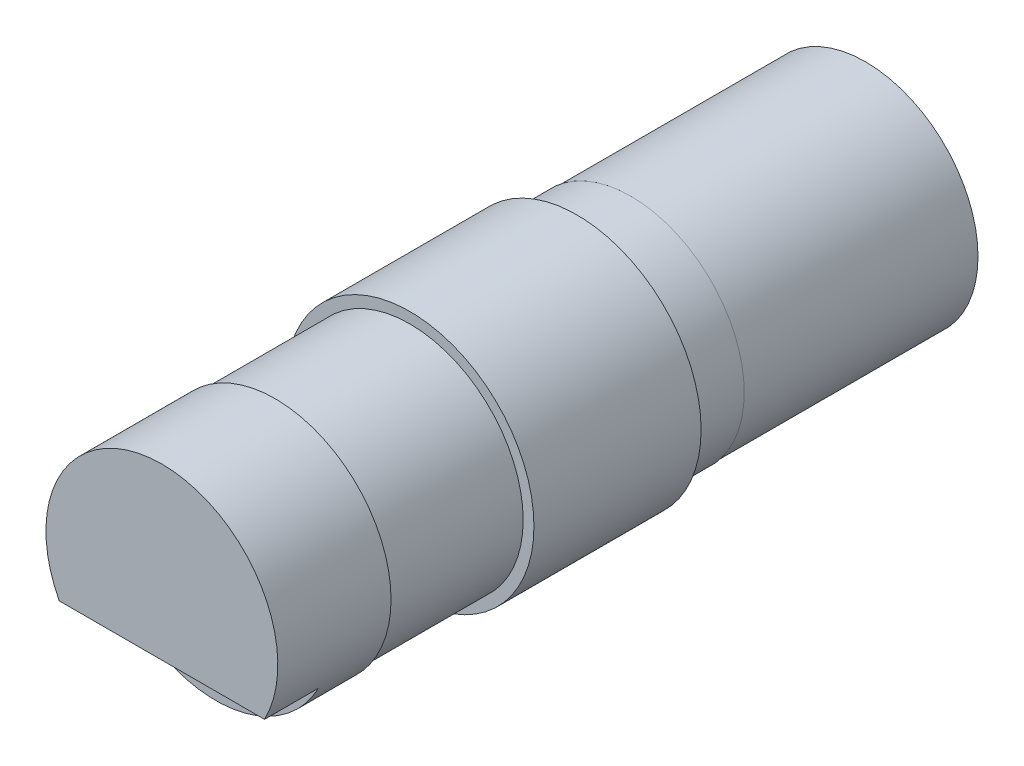
ISO-10303-21;
HEADER;
FILE_DESCRIPTION(('STEP AP214'),'2;1');
FILE_NAME('part.step','',(''),(''),'','','');
FILE_SCHEMA(('AUTOMOTIVE_DESIGN { 1 0 10303 214 1 1 1 1 }'));
ENDSEC;
DATA;
#1=APPLICATION_CONTEXT('core data for automotive mechanical design processes');
#2=APPLICATION_PROTOCOL_DEFINITION('international standard','automotive_design',2000,#1);
#3=PRODUCT_CONTEXT('',#1,'mechanical');
#4=PRODUCT('Part','Part','',(#3));
#5=PRODUCT_RELATED_PRODUCT_CATEGORY('part','',(#4));
#6=PRODUCT_DEFINITION_FORMATION('','',#4);
#7=PRODUCT_DEFINITION_CONTEXT('part definition',#1,'design');
#8=PRODUCT_DEFINITION('design','',#6,#7);
#9=PRODUCT_DEFINITION_SHAPE('','',#8);
#10=(LENGTH_UNIT() NAMED_UNIT(*) SI_UNIT(.MILLI.,.METRE.));
#11=(NAMED_UNIT(*) PLANE_ANGLE_UNIT() SI_UNIT($,.RADIAN.));
#12=(NAMED_UNIT(*) SI_UNIT($,.STERADIAN.) SOLID_ANGLE_UNIT());
#13=UNCERTAINTY_MEASURE_WITH_UNIT(LENGTH_MEASURE(1.E-05),#10,'distance_accuracy_value','');
#14=(GEOMETRIC_REPRESENTATION_CONTEXT(3) GLOBAL_UNCERTAINTY_ASSIGNED_CONTEXT((#13)) GLOBAL_UNIT_ASSIGNED_CONTEXT((#10,
#11,#12)) REPRESENTATION_CONTEXT('',''));
#15=CARTESIAN_POINT('',(0.,0.,0.));
#16=DIRECTION('',(0.,0.,1.));
#17=DIRECTION('',(1.,0.,0.));
#18=AXIS2_PLACEMENT_3D('',#15,#16,#17);
#19=CARTESIAN_POINT('',(0.,0.,-25.));
#20=DIRECTION('',(0.,0.,1.));
#21=DIRECTION('',(1.,0.,0.));
#22=AXIS2_PLACEMENT_3D('',#19,#20,#21);
#23=CYLINDRICAL_SURFACE('',#22,21.);
#24=CARTESIAN_POINT('',(0.,0.,-25.));
#25=DIRECTION('',(0.,0.,1.));
#26=DIRECTION('',(1.,0.,0.));
#27=AXIS2_PLACEMENT_3D('',#24,#25,#26);
#28=CIRCLE('',#27,21.);
#29=CARTESIAN_POINT('',(21.,0.,-25.));
#30=VERTEX_POINT('',#29);
#31=EDGE_CURVE('E110',#30,#30,#28,.T.);
#32=ORIENTED_EDGE('',*,*,#31,.T.);
#33=EDGE_LOOP('',(#32));
#34=FACE_BOUND('',#33,.T.);
#35=CARTESIAN_POINT('',(0.,0.,0.));
#36=DIRECTION('',(0.,0.,1.));
#37=DIRECTION('',(1.,0.,0.));
#38=AXIS2_PLACEMENT_3D('',#35,#36,#37);
#39=CIRCLE('',#38,21.);
#40=CARTESIAN_POINT('',(21.,0.,0.));
#41=VERTEX_POINT('',#40);
#42=EDGE_CURVE('E41',#41,#41,#39,.T.);
#43=ORIENTED_EDGE('',*,*,#42,.F.);
#44=EDGE_LOOP('',(#43));
#45=FACE_BOUND('',#44,.T.);
#46=ADVANCED_FACE('F38',(#34,#45),#23,.T.);
#47=CARTESIAN_POINT('',(0.,0.,-56.));
#48=DIRECTION('',(0.,0.,1.));
#49=DIRECTION('',(1.,0.,0.));
#50=AXIS2_PLACEMENT_3D('',#47,#48,#49);
#51=CYLINDRICAL_SURFACE('',#50,23.);
#52=CARTESIAN_POINT('',(0.,0.,-56.));
#53=DIRECTION('',(0.,0.,-1.));
#54=DIRECTION('',(-1.,0.,0.));
#55=AXIS2_PLACEMENT_3D('',#52,#53,#54);
#56=CIRCLE('',#55,23.);
#57=CARTESIAN_POINT('',(-23.,0.,-56.));
#58=VERTEX_POINT('',#57);
#59=EDGE_CURVE('E107',#58,#58,#56,.T.);
#60=ORIENTED_EDGE('',*,*,#59,.F.);
#61=EDGE_LOOP('',(#60));
#62=FACE_BOUND('',#61,.T.);
#63=CARTESIAN_POINT('',(0.,0.,-25.));
#64=DIRECTION('',(0.,0.,-1.));
#65=DIRECTION('',(-1.,0.,0.));
#66=AXIS2_PLACEMENT_3D('',#63,#64,#65);
#67=CIRCLE('',#66,23.);
#68=CARTESIAN_POINT('',(-23.,0.,-25.));
#69=VERTEX_POINT('',#68);
#70=EDGE_CURVE('E104',#69,#69,#67,.T.);
#71=ORIENTED_EDGE('',*,*,#70,.T.);
#72=EDGE_LOOP('',(#71));
#73=FACE_BOUND('',#72,.T.);
#74=ADVANCED_FACE('F122',(#62,#73),#51,.T.);
#75=CARTESIAN_POINT('',(0.,0.,-56.));
#76=DIRECTION('',(0.,0.,-1.));
#77=DIRECTION('',(-1.,0.,0.));
#78=AXIS2_PLACEMENT_3D('',#75,#76,#77);
#79=PLANE('',#78);
#80=CARTESIAN_POINT('',(0.,0.,-56.));
#81=DIRECTION('',(0.,0.,-1.));
#82=DIRECTION('',(-1.,0.,0.));
#83=AXIS2_PLACEMENT_3D('',#80,#81,#82);
#84=CIRCLE('',#83,21.);
#85=CARTESIAN_POINT('',(-21.,0.,-56.));
#86=VERTEX_POINT('',#85);
#87=EDGE_CURVE('E101',#86,#86,#84,.T.);
#88=ORIENTED_EDGE('',*,*,#87,.F.);
#89=EDGE_LOOP('',(#88));
#90=FACE_BOUND('',#89,.T.);
#91=ORIENTED_EDGE('',*,*,#59,.T.);
#92=EDGE_LOOP('',(#91));
#93=FACE_BOUND('',#92,.T.);
#94=ADVANCED_FACE('F126',(#90,#93),#79,.T.);
#95=CARTESIAN_POINT('',(0.,0.,-25.));
#96=DIRECTION('',(0.,0.,-1.));
#97=DIRECTION('',(-1.,0.,0.));
#98=AXIS2_PLACEMENT_3D('',#95,#96,#97);
#99=PLANE('',#98);
#100=ORIENTED_EDGE('',*,*,#31,.F.);
#101=EDGE_LOOP('',(#100));
#102=FACE_BOUND('',#101,.T.);
#103=ORIENTED_EDGE('',*,*,#70,.F.);
#104=EDGE_LOOP('',(#103));
#105=FACE_BOUND('',#104,.T.);
#106=ADVANCED_FACE('F131',(#102,#105),#99,.F.);
#107=CARTESIAN_POINT('',(0.,0.,-66.));
#108=DIRECTION('',(0.,0.,1.));
#109=DIRECTION('',(1.,0.,0.));
#110=AXIS2_PLACEMENT_3D('',#107,#108,#109);
#111=CYLINDRICAL_SURFACE('',#110,21.);
#112=CARTESIAN_POINT('',(0.,0.,-66.));
#113=DIRECTION('',(0.,0.,-1.));
#114=DIRECTION('',(-1.,0.,0.));
#115=AXIS2_PLACEMENT_3D('',#112,#113,#114);
#116=CIRCLE('',#115,21.);
#117=CARTESIAN_POINT('',(-21.,0.,-66.));
#118=VERTEX_POINT('',#117);
#119=EDGE_CURVE('E98',#118,#118,#116,.T.);
#120=ORIENTED_EDGE('',*,*,#119,.F.);
#121=EDGE_LOOP('',(#120));
#122=FACE_BOUND('',#121,.T.);
#123=ORIENTED_EDGE('',*,*,#87,.T.);
#124=EDGE_LOOP('',(#123));
#125=FACE_BOUND('',#124,.T.);
#126=ADVANCED_FACE('F138',(#122,#125),#111,.T.);
#127=CARTESIAN_POINT('',(0.,0.,-66.));
#128=DIRECTION('',(0.,0.,-1.));
#129=DIRECTION('',(-1.,0.,0.));
#130=AXIS2_PLACEMENT_3D('',#127,#128,#129);
#131=PLANE('',#130);
#132=CARTESIAN_POINT('',(0.,0.,-66.));
#133=DIRECTION('',(0.,0.,-1.));
#134=DIRECTION('',(-1.,0.,0.));
#135=AXIS2_PLACEMENT_3D('',#132,#133,#134);
#136=CIRCLE('',#135,20.85);
#137=CARTESIAN_POINT('',(-20.85,0.,-66.));
#138=VERTEX_POINT('',#137);
#139=EDGE_CURVE('E46',#138,#138,#136,.T.);
#140=ORIENTED_EDGE('',*,*,#139,.F.);
#141=EDGE_LOOP('',(#140));
#142=FACE_BOUND('',#141,.T.);
#143=ORIENTED_EDGE('',*,*,#119,.T.);
#144=EDGE_LOOP('',(#143));
#145=FACE_BOUND('',#144,.T.);
#146=ADVANCED_FACE('F143',(#142,#145),#131,.T.);
#147=CARTESIAN_POINT('',(0.,0.,-109.5));
#148=DIRECTION('',(0.,0.,1.));
#149=DIRECTION('',(1.,0.,0.));
#150=AXIS2_PLACEMENT_3D('',#147,#148,#149);
#151=CYLINDRICAL_SURFACE('',#150,20.85);
#152=CARTESIAN_POINT('',(0.,0.,-109.5));
#153=DIRECTION('',(0.,0.,-1.));
#154=DIRECTION('',(-1.,0.,0.));
#155=AXIS2_PLACEMENT_3D('',#152,#153,#154);
#156=CIRCLE('',#155,20.85);
#157=CARTESIAN_POINT('',(-20.85,0.,-109.5));
#158=VERTEX_POINT('',#157);
#159=EDGE_CURVE('E94',#158,#158,#156,.T.);
#160=ORIENTED_EDGE('',*,*,#159,.F.);
#161=EDGE_LOOP('',(#160));
#162=FACE_BOUND('',#161,.T.);
#163=ORIENTED_EDGE('',*,*,#139,.T.);
#164=EDGE_LOOP('',(#163));
#165=FACE_BOUND('',#164,.T.);
#166=ADVANCED_FACE('F147',(#162,#165),#151,.T.);
#167=CARTESIAN_POINT('',(0.,0.,-109.5));
#168=DIRECTION('',(0.,0.,-1.));
#169=DIRECTION('',(-1.,0.,0.));
#170=AXIS2_PLACEMENT_3D('',#167,#168,#169);
#171=PLANE('',#170);
#172=CARTESIAN_POINT('',(0.,17.5,-109.5));
#173=DIRECTION('',(0.,0.,-1.));
#174=DIRECTION('',(-1.,0.,0.));
#175=AXIS2_PLACEMENT_3D('',#172,#173,#174);
#176=CIRCLE('',#175,2.);
#177=CARTESIAN_POINT('',(-2.,17.5,-109.5));
#178=VERTEX_POINT('',#177);
#179=EDGE_CURVE('E219',#178,#178,#176,.T.);
#180=ORIENTED_EDGE('',*,*,#179,.F.);
#181=EDGE_LOOP('',(#180));
#182=FACE_BOUND('',#181,.T.);
#183=CARTESIAN_POINT('',(-17.5000000000005,4.94165217184309E-13,-109.5));
#184=DIRECTION('',(0.,0.,-1.));
#185=DIRECTION('',(-1.,0.,0.));
#186=AXIS2_PLACEMENT_3D('',#183,#184,#185);
#187=CIRCLE('',#186,2.00000000000039);
#188=CARTESIAN_POINT('',(-19.5000000000009,4.94165217184309E-13,-109.5));
#189=VERTEX_POINT('',#188);
#190=EDGE_CURVE('E227',#189,#189,#187,.T.);
#191=ORIENTED_EDGE('',*,*,#190,.F.);
#192=EDGE_LOOP('',(#191));
#193=FACE_BOUND('',#192,.T.);
#194=CARTESIAN_POINT('',(-9.88330434368617E-13,-17.5,-109.5));
#195=DIRECTION('',(0.,0.,-1.));
#196=DIRECTION('',(-1.,0.,0.));
#197=AXIS2_PLACEMENT_3D('',#194,#195,#196);
#198=CIRCLE('',#197,2.00000000000106);
#199=CARTESIAN_POINT('',(-2.00000000000205,-17.5,-109.5));
#200=VERTEX_POINT('',#199);
#201=EDGE_CURVE('E233',#200,#200,#198,.T.);
#202=ORIENTED_EDGE('',*,*,#201,.F.);
#203=EDGE_LOOP('',(#202));
#204=FACE_BOUND('',#203,.T.);
#205=CARTESIAN_POINT('',(17.4999999999995,-4.96308349082816E-13,-109.5));
#206=DIRECTION('',(0.,0.,-1.));
#207=DIRECTION('',(-1.,0.,0.));
#208=AXIS2_PLACEMENT_3D('',#205,#206,#207);
#209=CIRCLE('',#208,2.0000000000008);
#210=CARTESIAN_POINT('',(15.4999999999987,-4.96308349082816E-13,-109.5));
#211=VERTEX_POINT('',#210);
#212=EDGE_CURVE('E239',#211,#211,#209,.T.);
#213=ORIENTED_EDGE('',*,*,#212,.F.);
#214=EDGE_LOOP('',(#213));
#215=FACE_BOUND('',#214,.T.);
#216=CARTESIAN_POINT('',(0.,0.,-109.5));
#217=DIRECTION('',(0.,0.,-1.));
#218=DIRECTION('',(-1.,0.,0.));
#219=AXIS2_PLACEMENT_3D('',#216,#217,#218);
#220=CIRCLE('',#219,13.);
#221=CARTESIAN_POINT('',(-13.,0.,-109.5));
#222=VERTEX_POINT('',#221);
#223=EDGE_CURVE('E11',#222,#222,#220,.T.);
#224=ORIENTED_EDGE('',*,*,#223,.F.);
#225=EDGE_LOOP('',(#224));
#226=FACE_BOUND('',#225,.T.);
#227=ORIENTED_EDGE('',*,*,#159,.T.);
#228=EDGE_LOOP('',(#227));
#229=FACE_BOUND('',#228,.T.);
#230=ADVANCED_FACE('F151',(#182,#193,#204,#215,#226,#229),#171,.T.);
#231=CARTESIAN_POINT('',(0.,0.,-111.5));
#232=DIRECTION('',(0.,0.,1.));
#233=DIRECTION('',(1.,0.,0.));
#234=AXIS2_PLACEMENT_3D('',#231,#232,#233);
#235=CYLINDRICAL_SURFACE('',#234,13.);
#236=CARTESIAN_POINT('',(0.,0.,-111.5));
#237=DIRECTION('',(0.,0.,-1.));
#238=DIRECTION('',(-1.,0.,0.));
#239=AXIS2_PLACEMENT_3D('',#236,#237,#238);
#240=CIRCLE('',#239,13.);
#241=CARTESIAN_POINT('',(-13.,0.,-111.5));
#242=VERTEX_POINT('',#241);
#243=EDGE_CURVE('E91',#242,#242,#240,.T.);
#244=ORIENTED_EDGE('',*,*,#243,.F.);
#245=EDGE_LOOP('',(#244));
#246=FACE_BOUND('',#245,.T.);
#247=ORIENTED_EDGE('',*,*,#223,.T.);
#248=EDGE_LOOP('',(#247));
#249=FACE_BOUND('',#248,.T.);
#250=ADVANCED_FACE('F155',(#246,#249),#235,.T.);
#251=CARTESIAN_POINT('',(0.,0.,-111.5));
#252=DIRECTION('',(0.,0.,-1.));
#253=DIRECTION('',(-1.,0.,0.));
#254=AXIS2_PLACEMENT_3D('',#251,#252,#253);
#255=PLANE('',#254);
#256=CARTESIAN_POINT('',(0.,0.,-111.5));
#257=DIRECTION('',(0.,0.,-1.));
#258=DIRECTION('',(-1.,0.,0.));
#259=AXIS2_PLACEMENT_3D('',#256,#257,#258);
#260=CIRCLE('',#259,4.);
#261=CARTESIAN_POINT('',(-4.,0.,-111.5));
#262=VERTEX_POINT('',#261);
#263=EDGE_CURVE('E81',#262,#262,#260,.T.);
#264=ORIENTED_EDGE('',*,*,#263,.F.);
#265=EDGE_LOOP('',(#264));
#266=FACE_BOUND('',#265,.T.);
#267=ORIENTED_EDGE('',*,*,#243,.T.);
#268=EDGE_LOOP('',(#267));
#269=FACE_BOUND('',#268,.T.);
#270=ADVANCED_FACE('F159',(#266,#269),#255,.T.);
#271=CARTESIAN_POINT('',(0.,0.,-108.5));
#272=DIRECTION('',(0.,0.,-1.));
#273=DIRECTION('',(-1.,0.,0.));
#274=AXIS2_PLACEMENT_3D('',#271,#272,#273);
#275=CYLINDRICAL_SURFACE('',#274,4.);
#276=CARTESIAN_POINT('',(0.,0.,-108.5));
#277=DIRECTION('',(0.,0.,-1.));
#278=DIRECTION('',(-1.,0.,0.));
#279=AXIS2_PLACEMENT_3D('',#276,#277,#278);
#280=CIRCLE('',#279,4.);
#281=CARTESIAN_POINT('',(-4.,0.,-108.5));
#282=VERTEX_POINT('',#281);
#283=EDGE_CURVE('E84',#282,#282,#280,.T.);
#284=ORIENTED_EDGE('',*,*,#283,.F.);
#285=EDGE_LOOP('',(#284));
#286=FACE_BOUND('',#285,.T.);
#287=ORIENTED_EDGE('',*,*,#263,.T.);
#288=EDGE_LOOP('',(#287));
#289=FACE_BOUND('',#288,.T.);
#290=ADVANCED_FACE('F163',(#286,#289),#275,.F.);
#291=CARTESIAN_POINT('',(0.,0.,-108.5));
#292=DIRECTION('',(0.,0.,-1.));
#293=DIRECTION('',(-1.,0.,0.));
#294=AXIS2_PLACEMENT_3D('',#291,#292,#293);
#295=PLANE('',#294);
#296=ORIENTED_EDGE('',*,*,#283,.T.);
#297=EDGE_LOOP('',(#296));
#298=FACE_BOUND('',#297,.T.);
#299=ADVANCED_FACE('F167',(#298),#295,.T.);
#300=CARTESIAN_POINT('',(0.,0.,21.));
#301=DIRECTION('',(0.,0.,-1.));
#302=DIRECTION('',(-1.,0.,0.));
#303=AXIS2_PLACEMENT_3D('',#300,#301,#302);
#304=CYLINDRICAL_SURFACE('',#303,21.5);
#305=CARTESIAN_POINT('',(0.,0.,21.));
#306=DIRECTION('',(0.,0.,1.));
#307=DIRECTION('',(1.,0.,0.));
#308=AXIS2_PLACEMENT_3D('',#305,#306,#307);
#309=CIRCLE('',#308,21.5);
#310=CARTESIAN_POINT('',(19.0328663106743,-10.,21.));
#311=VERTEX_POINT('',#310);
#312=CARTESIAN_POINT('',(-19.0328663106743,-10.,21.));
#313=VERTEX_POINT('',#312);
#314=EDGE_CURVE('E77',#311,#313,#309,.T.);
#315=ORIENTED_EDGE('',*,*,#314,.F.);
#316=DIRECTION('',(0.,0.,1.));
#317=VECTOR('',#316,1.);
#318=CARTESIAN_POINT('',(19.0328663106743,-10.,11.));
#319=LINE('',#318,#317);
#320=CARTESIAN_POINT('',(19.0328663106743,-10.,11.));
#321=VERTEX_POINT('',#320);
#322=EDGE_CURVE('E54',#321,#311,#319,.T.);
#323=ORIENTED_EDGE('',*,*,#322,.F.);
#324=CARTESIAN_POINT('',(0.,0.,11.));
#325=DIRECTION('',(0.,0.,1.));
#326=DIRECTION('',(1.,0.,0.));
#327=AXIS2_PLACEMENT_3D('',#324,#325,#326);
#328=CIRCLE('',#327,21.5);
#329=CARTESIAN_POINT('',(-19.0328663106743,-10.,11.));
#330=VERTEX_POINT('',#329);
#331=EDGE_CURVE('E70',#330,#321,#328,.T.);
#332=ORIENTED_EDGE('',*,*,#331,.F.);
#333=DIRECTION('',(0.,0.,1.));
#334=VECTOR('',#333,1.);
#335=CARTESIAN_POINT('',(-19.0328663106743,-10.,11.));
#336=LINE('',#335,#334);
#337=EDGE_CURVE('E60',#330,#313,#336,.T.);
#338=ORIENTED_EDGE('',*,*,#337,.T.);
#339=EDGE_LOOP('',(#315,#323,#332,#338));
#340=FACE_BOUND('',#339,.T.);
#341=CARTESIAN_POINT('',(0.,0.,0.));
#342=DIRECTION('',(0.,0.,1.));
#343=DIRECTION('',(1.,0.,0.));
#344=AXIS2_PLACEMENT_3D('',#341,#342,#343);
#345=CIRCLE('',#344,21.5);
#346=CARTESIAN_POINT('',(21.5,0.,0.));
#347=VERTEX_POINT('',#346);
#348=EDGE_CURVE('E78',#347,#347,#345,.T.);
#349=ORIENTED_EDGE('',*,*,#348,.T.);
#350=EDGE_LOOP('',(#349));
#351=FACE_BOUND('',#350,.T.);
#352=ADVANCED_FACE('F75',(#340,#351),#304,.T.);
#353=CARTESIAN_POINT('',(0.,0.,21.));
#354=DIRECTION('',(0.,0.,1.));
#355=DIRECTION('',(1.,0.,0.));
#356=AXIS2_PLACEMENT_3D('',#353,#354,#355);
#357=PLANE('',#356);
#358=DIRECTION('',(-1.,0.,0.));
#359=VECTOR('',#358,1.);
#360=CARTESIAN_POINT('',(-19.0328663106743,-10.,21.));
#361=LINE('',#360,#359);
#362=EDGE_CURVE('E65',#311,#313,#361,.T.);
#363=ORIENTED_EDGE('',*,*,#362,.F.);
#364=ORIENTED_EDGE('',*,*,#314,.T.);
#365=EDGE_LOOP('',(#363,#364));
#366=FACE_BOUND('',#365,.T.);
#367=ADVANCED_FACE('F80',(#366),#357,.T.);
#368=CARTESIAN_POINT('',(0.,0.,0.));
#369=DIRECTION('',(0.,0.,1.));
#370=DIRECTION('',(1.,0.,0.));
#371=AXIS2_PLACEMENT_3D('',#368,#369,#370);
#372=PLANE('',#371);
#373=ORIENTED_EDGE('',*,*,#42,.T.);
#374=EDGE_LOOP('',(#373));
#375=FACE_BOUND('',#374,.T.);
#376=ORIENTED_EDGE('',*,*,#348,.F.);
#377=EDGE_LOOP('',(#376));
#378=FACE_BOUND('',#377,.T.);
#379=ADVANCED_FACE('F118',(#375,#378),#372,.F.);
#380=CARTESIAN_POINT('',(-19.0328663106743,-10.,11.));
#381=DIRECTION('',(0.,1.,0.));
#382=DIRECTION('',(0.,0.,1.));
#383=AXIS2_PLACEMENT_3D('',#380,#381,#382);
#384=PLANE('',#383);
#385=ORIENTED_EDGE('',*,*,#362,.T.);
#386=ORIENTED_EDGE('',*,*,#337,.F.);
#387=DIRECTION('',(-1.,0.,0.));
#388=VECTOR('',#387,1.);
#389=CARTESIAN_POINT('',(-19.0328663106743,-10.,11.));
#390=LINE('',#389,#388);
#391=EDGE_CURVE('E243',#321,#330,#390,.T.);
#392=ORIENTED_EDGE('',*,*,#391,.F.);
#393=ORIENTED_EDGE('',*,*,#322,.T.);
#394=EDGE_LOOP('',(#385,#386,#392,#393));
#395=FACE_BOUND('',#394,.T.);
#396=ADVANCED_FACE('F66',(#395),#384,.F.);
#397=CARTESIAN_POINT('',(0.,0.,11.));
#398=DIRECTION('',(0.,0.,1.));
#399=DIRECTION('',(1.,0.,0.));
#400=AXIS2_PLACEMENT_3D('',#397,#398,#399);
#401=PLANE('',#400);
#402=ORIENTED_EDGE('',*,*,#331,.T.);
#403=ORIENTED_EDGE('',*,*,#391,.T.);
#404=EDGE_LOOP('',(#402,#403));
#405=FACE_BOUND('',#404,.T.);
#406=ADVANCED_FACE('F180',(#405),#401,.T.);
#407=CARTESIAN_POINT('',(17.4999999999995,-4.96308349082816E-13,-102.5));
#408=DIRECTION('',(0.,0.,-1.));
#409=DIRECTION('',(-1.,0.,0.));
#410=AXIS2_PLACEMENT_3D('',#407,#408,#409);
#411=CYLINDRICAL_SURFACE('',#410,2.0000000000008);
#412=CARTESIAN_POINT('',(17.4999999999995,-4.96308349082816E-13,-102.5));
#413=DIRECTION('',(0.,0.,-1.));
#414=DIRECTION('',(-1.,0.,0.));
#415=AXIS2_PLACEMENT_3D('',#412,#413,#414);
#416=CIRCLE('',#415,2.0000000000008);
#417=CARTESIAN_POINT('',(15.4999999999987,-4.96308349082816E-13,-102.5));
#418=VERTEX_POINT('',#417);
#419=EDGE_CURVE('E236',#418,#418,#416,.T.);
#420=ORIENTED_EDGE('',*,*,#419,.F.);
#421=EDGE_LOOP('',(#420));
#422=FACE_BOUND('',#421,.T.);
#423=ORIENTED_EDGE('',*,*,#212,.T.);
#424=EDGE_LOOP('',(#423));
#425=FACE_BOUND('',#424,.T.);
#426=ADVANCED_FACE('F183',(#422,#425),#411,.F.);
#427=CARTESIAN_POINT('',(17.4999999999995,-4.96308349082816E-13,-102.5));
#428=DIRECTION('',(0.,0.,-1.));
#429=DIRECTION('',(-1.,0.,0.));
#430=AXIS2_PLACEMENT_3D('',#427,#428,#429);
#431=PLANE('',#430);
#432=ORIENTED_EDGE('',*,*,#419,.T.);
#433=EDGE_LOOP('',(#432));
#434=FACE_BOUND('',#433,.T.);
#435=ADVANCED_FACE('F187',(#434),#431,.T.);
#436=CARTESIAN_POINT('',(-9.88330434368617E-13,-17.5,-102.5));
#437=DIRECTION('',(0.,0.,-1.));
#438=DIRECTION('',(-1.,0.,0.));
#439=AXIS2_PLACEMENT_3D('',#436,#437,#438);
#440=CYLINDRICAL_SURFACE('',#439,2.00000000000106);
#441=CARTESIAN_POINT('',(-9.88330434368617E-13,-17.5,-102.5));
#442=DIRECTION('',(0.,0.,-1.));
#443=DIRECTION('',(-1.,0.,0.));
#444=AXIS2_PLACEMENT_3D('',#441,#442,#443);
#445=CIRCLE('',#444,2.00000000000106);
#446=CARTESIAN_POINT('',(-2.00000000000205,-17.5,-102.5));
#447=VERTEX_POINT('',#446);
#448=EDGE_CURVE('E230',#447,#447,#445,.T.);
#449=ORIENTED_EDGE('',*,*,#448,.F.);
#450=EDGE_LOOP('',(#449));
#451=FACE_BOUND('',#450,.T.);
#452=ORIENTED_EDGE('',*,*,#201,.T.);
#453=EDGE_LOOP('',(#452));
#454=FACE_BOUND('',#453,.T.);
#455=ADVANCED_FACE('F191',(#451,#454),#440,.F.);
#456=CARTESIAN_POINT('',(-9.88330434368617E-13,-17.5,-102.5));
#457=DIRECTION('',(0.,0.,-1.));
#458=DIRECTION('',(-1.,0.,0.));
#459=AXIS2_PLACEMENT_3D('',#456,#457,#458);
#460=PLANE('',#459);
#461=ORIENTED_EDGE('',*,*,#448,.T.);
#462=EDGE_LOOP('',(#461));
#463=FACE_BOUND('',#462,.T.);
#464=ADVANCED_FACE('F195',(#463),#460,.T.);
#465=CARTESIAN_POINT('',(-17.5000000000005,4.94165217184309E-13,-102.5));
#466=DIRECTION('',(0.,0.,-1.));
#467=DIRECTION('',(-1.,0.,0.));
#468=AXIS2_PLACEMENT_3D('',#465,#466,#467);
#469=CYLINDRICAL_SURFACE('',#468,2.00000000000039);
#470=CARTESIAN_POINT('',(-17.5000000000005,4.94165217184309E-13,-102.5));
#471=DIRECTION('',(0.,0.,-1.));
#472=DIRECTION('',(-1.,0.,0.));
#473=AXIS2_PLACEMENT_3D('',#470,#471,#472);
#474=CIRCLE('',#473,2.00000000000039);
#475=CARTESIAN_POINT('',(-19.5000000000009,4.94165217184309E-13,-102.5));
#476=VERTEX_POINT('',#475);
#477=EDGE_CURVE('E222',#476,#476,#474,.T.);
#478=ORIENTED_EDGE('',*,*,#477,.F.);
#479=EDGE_LOOP('',(#478));
#480=FACE_BOUND('',#479,.T.);
#481=ORIENTED_EDGE('',*,*,#190,.T.);
#482=EDGE_LOOP('',(#481));
#483=FACE_BOUND('',#482,.T.);
#484=ADVANCED_FACE('F199',(#480,#483),#469,.F.);
#485=CARTESIAN_POINT('',(-17.5000000000005,4.94165217184309E-13,-102.5));
#486=DIRECTION('',(0.,0.,-1.));
#487=DIRECTION('',(-1.,0.,0.));
#488=AXIS2_PLACEMENT_3D('',#485,#486,#487);
#489=PLANE('',#488);
#490=ORIENTED_EDGE('',*,*,#477,.T.);
#491=EDGE_LOOP('',(#490));
#492=FACE_BOUND('',#491,.T.);
#493=ADVANCED_FACE('F203',(#492),#489,.T.);
#494=CARTESIAN_POINT('',(0.,17.5,-102.5));
#495=DIRECTION('',(0.,0.,-1.));
#496=DIRECTION('',(-1.,0.,0.));
#497=AXIS2_PLACEMENT_3D('',#494,#495,#496);
#498=CYLINDRICAL_SURFACE('',#497,2.);
#499=CARTESIAN_POINT('',(0.,17.5,-102.5));
#500=DIRECTION('',(0.,0.,-1.));
#501=DIRECTION('',(-1.,0.,0.));
#502=AXIS2_PLACEMENT_3D('',#499,#500,#501);
#503=CIRCLE('',#502,2.);
#504=CARTESIAN_POINT('',(-2.,17.5,-102.5));
#505=VERTEX_POINT('',#504);
#506=EDGE_CURVE('E71',#505,#505,#503,.T.);
#507=ORIENTED_EDGE('',*,*,#506,.F.);
#508=EDGE_LOOP('',(#507));
#509=FACE_BOUND('',#508,.T.);
#510=ORIENTED_EDGE('',*,*,#179,.T.);
#511=EDGE_LOOP('',(#510));
#512=FACE_BOUND('',#511,.T.);
#513=ADVANCED_FACE('F207',(#509,#512),#498,.F.);
#514=CARTESIAN_POINT('',(0.,17.5,-102.5));
#515=DIRECTION('',(0.,0.,-1.));
#516=DIRECTION('',(-1.,0.,0.));
#517=AXIS2_PLACEMENT_3D('',#514,#515,#516);
#518=PLANE('',#517);
#519=ORIENTED_EDGE('',*,*,#506,.T.);
#520=EDGE_LOOP('',(#519));
#521=FACE_BOUND('',#520,.T.);
#522=ADVANCED_FACE('F211',(#521),#518,.T.);
#523=CLOSED_SHELL('',(#46,#74,#94,#106,#126,#146,#166,#230,#250,#270,#290,#299,#352,#367,#379,
#396,#406,#426,#435,#455,#464,#484,#493,#513,#522));
#524=MANIFOLD_SOLID_BREP('B2',#523);
#525=ADVANCED_BREP_SHAPE_REPRESENTATION('',(#18,#524),#14);
#526=SHAPE_DEFINITION_REPRESENTATION(#9,#525);
ENDSEC;
END-ISO-10303-21;
